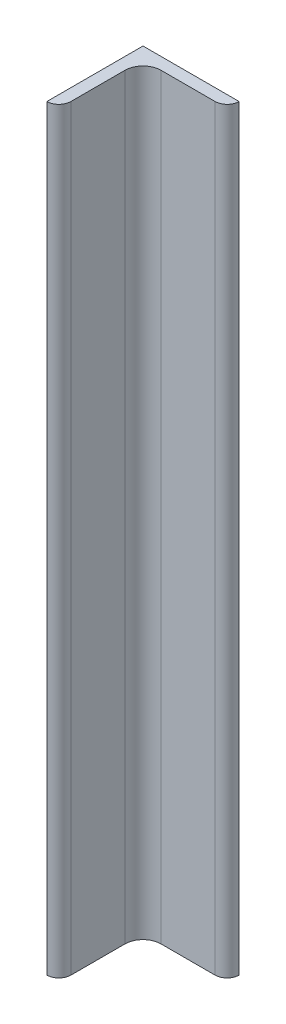
ISO-10303-21;
HEADER;
FILE_DESCRIPTION(('STEP AP214'),'2;1');
FILE_NAME('part.step','',(''),(''),'','','');
FILE_SCHEMA(('AUTOMOTIVE_DESIGN { 1 0 10303 214 1 1 1 1 }'));
ENDSEC;
DATA;
#1=APPLICATION_CONTEXT('core data for automotive mechanical design processes');
#2=APPLICATION_PROTOCOL_DEFINITION('international standard','automotive_design',2000,#1);
#3=PRODUCT_CONTEXT('',#1,'mechanical');
#4=PRODUCT('Part','Part','',(#3));
#5=PRODUCT_RELATED_PRODUCT_CATEGORY('part','',(#4));
#6=PRODUCT_DEFINITION_FORMATION('','',#4);
#7=PRODUCT_DEFINITION_CONTEXT('part definition',#1,'design');
#8=PRODUCT_DEFINITION('design','',#6,#7);
#9=PRODUCT_DEFINITION_SHAPE('','',#8);
#10=(LENGTH_UNIT() NAMED_UNIT(*) SI_UNIT(.MILLI.,.METRE.));
#11=(NAMED_UNIT(*) PLANE_ANGLE_UNIT() SI_UNIT($,.RADIAN.));
#12=(NAMED_UNIT(*) SI_UNIT($,.STERADIAN.) SOLID_ANGLE_UNIT());
#13=UNCERTAINTY_MEASURE_WITH_UNIT(LENGTH_MEASURE(1.E-05),#10,'distance_accuracy_value','');
#14=(GEOMETRIC_REPRESENTATION_CONTEXT(3) GLOBAL_UNCERTAINTY_ASSIGNED_CONTEXT((#13)) GLOBAL_UNIT_ASSIGNED_CONTEXT((#10,
#11,#12)) REPRESENTATION_CONTEXT('',''));
#15=CARTESIAN_POINT('',(0.,0.,0.));
#16=DIRECTION('',(0.,0.,1.));
#17=DIRECTION('',(1.,0.,0.));
#18=AXIS2_PLACEMENT_3D('',#15,#16,#17);
#19=CARTESIAN_POINT('',(0.,200.,25.4));
#20=DIRECTION('',(1.,0.,0.));
#21=DIRECTION('',(0.,0.,-1.));
#22=AXIS2_PLACEMENT_3D('',#19,#20,#21);
#23=PLANE('',#22);
#24=DIRECTION('',(0.,0.,1.));
#25=VECTOR('',#24,1.);
#26=CARTESIAN_POINT('',(0.,0.,25.4));
#27=LINE('',#26,#25);
#28=CARTESIAN_POINT('',(0.,0.,0.));
#29=VERTEX_POINT('',#28);
#30=CARTESIAN_POINT('',(0.,0.,25.4));
#31=VERTEX_POINT('',#30);
#32=EDGE_CURVE('E169',#29,#31,#27,.T.);
#33=ORIENTED_EDGE('',*,*,#32,.T.);
#34=DIRECTION('',(0.,-1.,0.));
#35=VECTOR('',#34,1.);
#36=CARTESIAN_POINT('',(0.,200.,25.4));
#37=LINE('',#36,#35);
#38=CARTESIAN_POINT('',(0.,200.,25.4));
#39=VERTEX_POINT('',#38);
#40=EDGE_CURVE('E13',#39,#31,#37,.T.);
#41=ORIENTED_EDGE('',*,*,#40,.F.);
#42=DIRECTION('',(0.,0.,1.));
#43=VECTOR('',#42,1.);
#44=CARTESIAN_POINT('',(0.,200.,25.4));
#45=LINE('',#44,#43);
#46=CARTESIAN_POINT('',(0.,200.,0.));
#47=VERTEX_POINT('',#46);
#48=EDGE_CURVE('E185',#47,#39,#45,.T.);
#49=ORIENTED_EDGE('',*,*,#48,.F.);
#50=DIRECTION('',(0.,-1.,0.));
#51=VECTOR('',#50,1.);
#52=CARTESIAN_POINT('',(0.,200.,0.));
#53=LINE('',#52,#51);
#54=EDGE_CURVE('E165',#47,#29,#53,.T.);
#55=ORIENTED_EDGE('',*,*,#54,.T.);
#56=EDGE_LOOP('',(#33,#41,#49,#55));
#57=FACE_BOUND('',#56,.T.);
#58=ADVANCED_FACE('F67',(#57),#23,.F.);
#59=CARTESIAN_POINT('',(0.00508,200.,25.4));
#60=DIRECTION('',(0.,0.,-1.));
#61=DIRECTION('',(-1.,0.,0.));
#62=AXIS2_PLACEMENT_3D('',#59,#60,#61);
#63=PLANE('',#62);
#64=DIRECTION('',(1.,0.,0.));
#65=VECTOR('',#64,1.);
#66=CARTESIAN_POINT('',(0.00508,0.,25.4));
#67=LINE('',#66,#65);
#68=CARTESIAN_POINT('',(0.00508,0.,25.4));
#69=VERTEX_POINT('',#68);
#70=EDGE_CURVE('E172',#31,#69,#67,.T.);
#71=ORIENTED_EDGE('',*,*,#70,.T.);
#72=DIRECTION('',(0.,-1.,0.));
#73=VECTOR('',#72,1.);
#74=CARTESIAN_POINT('',(0.00508,200.,25.4));
#75=LINE('',#74,#73);
#76=CARTESIAN_POINT('',(0.00508,200.,25.4));
#77=VERTEX_POINT('',#76);
#78=EDGE_CURVE('E75',#77,#69,#75,.T.);
#79=ORIENTED_EDGE('',*,*,#78,.F.);
#80=DIRECTION('',(1.,0.,0.));
#81=VECTOR('',#80,1.);
#82=CARTESIAN_POINT('',(0.00508,200.,25.4));
#83=LINE('',#82,#81);
#84=EDGE_CURVE('E129',#39,#77,#83,.T.);
#85=ORIENTED_EDGE('',*,*,#84,.F.);
#86=ORIENTED_EDGE('',*,*,#40,.T.);
#87=EDGE_LOOP('',(#71,#79,#85,#86));
#88=FACE_BOUND('',#87,.T.);
#89=ADVANCED_FACE('F228',(#88),#63,.F.);
#90=CARTESIAN_POINT('',(0.00507999999999961,200.,22.23008));
#91=DIRECTION('',(0.,-1.,0.));
#92=DIRECTION('',(0.,0.,-1.));
#93=AXIS2_PLACEMENT_3D('',#90,#91,#92);
#94=CYLINDRICAL_SURFACE('',#93,3.16992);
#95=CARTESIAN_POINT('',(0.00507999999999961,0.,22.23008));
#96=DIRECTION('',(0.,1.,0.));
#97=DIRECTION('',(0.,0.,1.));
#98=AXIS2_PLACEMENT_3D('',#95,#96,#97);
#99=CIRCLE('',#98,3.16992);
#100=CARTESIAN_POINT('',(3.17499999999999,0.,22.23008));
#101=VERTEX_POINT('',#100);
#102=EDGE_CURVE('E174',#69,#101,#99,.T.);
#103=ORIENTED_EDGE('',*,*,#102,.T.);
#104=DIRECTION('',(0.,-1.,0.));
#105=VECTOR('',#104,1.);
#106=CARTESIAN_POINT('',(3.17499999999999,200.,22.23008));
#107=LINE('',#106,#105);
#108=CARTESIAN_POINT('',(3.17499999999999,200.,22.23008));
#109=VERTEX_POINT('',#108);
#110=EDGE_CURVE('E195',#109,#101,#107,.T.);
#111=ORIENTED_EDGE('',*,*,#110,.F.);
#112=CARTESIAN_POINT('',(0.00507999999999961,200.,22.23008));
#113=DIRECTION('',(0.,1.,0.));
#114=DIRECTION('',(0.,0.,1.));
#115=AXIS2_PLACEMENT_3D('',#112,#113,#114);
#116=CIRCLE('',#115,3.16992);
#117=EDGE_CURVE('E203',#77,#109,#116,.T.);
#118=ORIENTED_EDGE('',*,*,#117,.F.);
#119=ORIENTED_EDGE('',*,*,#78,.T.);
#120=EDGE_LOOP('',(#103,#111,#118,#119));
#121=FACE_BOUND('',#120,.T.);
#122=ADVANCED_FACE('F201',(#121),#94,.T.);
#123=CARTESIAN_POINT('',(3.17499999999999,200.,7.93750000000001));
#124=DIRECTION('',(-1.,0.,0.));
#125=DIRECTION('',(0.,0.,1.));
#126=AXIS2_PLACEMENT_3D('',#123,#124,#125);
#127=PLANE('',#126);
#128=DIRECTION('',(0.,0.,-1.));
#129=VECTOR('',#128,1.);
#130=CARTESIAN_POINT('',(3.17499999999999,0.,7.93750000000001));
#131=LINE('',#130,#129);
#132=CARTESIAN_POINT('',(3.17499999999999,0.,7.93750000000002));
#133=VERTEX_POINT('',#132);
#134=EDGE_CURVE('E176',#101,#133,#131,.T.);
#135=ORIENTED_EDGE('',*,*,#134,.T.);
#136=DIRECTION('',(0.,-1.,0.));
#137=VECTOR('',#136,1.);
#138=CARTESIAN_POINT('',(3.17499999999999,200.,7.93750000000002));
#139=LINE('',#138,#137);
#140=CARTESIAN_POINT('',(3.17499999999999,200.,7.93750000000002));
#141=VERTEX_POINT('',#140);
#142=EDGE_CURVE('E192',#141,#133,#139,.T.);
#143=ORIENTED_EDGE('',*,*,#142,.F.);
#144=DIRECTION('',(0.,0.,-1.));
#145=VECTOR('',#144,1.);
#146=CARTESIAN_POINT('',(3.17499999999999,200.,7.93750000000001));
#147=LINE('',#146,#145);
#148=EDGE_CURVE('E219',#109,#141,#147,.T.);
#149=ORIENTED_EDGE('',*,*,#148,.F.);
#150=ORIENTED_EDGE('',*,*,#110,.T.);
#151=EDGE_LOOP('',(#135,#143,#149,#150));
#152=FACE_BOUND('',#151,.T.);
#153=ADVANCED_FACE('F212',(#152),#127,.F.);
#154=CARTESIAN_POINT('',(7.93749999999999,200.,7.93750000000001));
#155=DIRECTION('',(0.,-1.,0.));
#156=DIRECTION('',(0.,0.,-1.));
#157=AXIS2_PLACEMENT_3D('',#154,#155,#156);
#158=CYLINDRICAL_SURFACE('',#157,4.7625);
#159=CARTESIAN_POINT('',(7.93749999999999,0.,7.93750000000001));
#160=DIRECTION('',(0.,-1.,0.));
#161=DIRECTION('',(0.,0.,-1.));
#162=AXIS2_PLACEMENT_3D('',#159,#160,#161);
#163=CIRCLE('',#162,4.7625);
#164=CARTESIAN_POINT('',(7.93749999999999,0.,3.17500000000001));
#165=VERTEX_POINT('',#164);
#166=EDGE_CURVE('E178',#133,#165,#163,.T.);
#167=ORIENTED_EDGE('',*,*,#166,.T.);
#168=DIRECTION('',(0.,-1.,0.));
#169=VECTOR('',#168,1.);
#170=CARTESIAN_POINT('',(7.93749999999999,200.,3.17500000000001));
#171=LINE('',#170,#169);
#172=CARTESIAN_POINT('',(7.93749999999999,200.,3.17500000000001));
#173=VERTEX_POINT('',#172);
#174=EDGE_CURVE('E189',#173,#165,#171,.T.);
#175=ORIENTED_EDGE('',*,*,#174,.F.);
#176=CARTESIAN_POINT('',(7.93749999999999,200.,7.93750000000001));
#177=DIRECTION('',(0.,-1.,0.));
#178=DIRECTION('',(0.,0.,-1.));
#179=AXIS2_PLACEMENT_3D('',#176,#177,#178);
#180=CIRCLE('',#179,4.7625);
#181=EDGE_CURVE('E218',#141,#173,#180,.T.);
#182=ORIENTED_EDGE('',*,*,#181,.F.);
#183=ORIENTED_EDGE('',*,*,#142,.T.);
#184=EDGE_LOOP('',(#167,#175,#182,#183));
#185=FACE_BOUND('',#184,.T.);
#186=ADVANCED_FACE('F216',(#185),#158,.F.);
#187=CARTESIAN_POINT('',(22.23008,200.,3.17499999999999));
#188=DIRECTION('',(0.,0.,-1.));
#189=DIRECTION('',(-1.,0.,0.));
#190=AXIS2_PLACEMENT_3D('',#187,#188,#189);
#191=PLANE('',#190);
#192=DIRECTION('',(1.,0.,0.));
#193=VECTOR('',#192,1.);
#194=CARTESIAN_POINT('',(22.23008,0.,3.17499999999999));
#195=LINE('',#194,#193);
#196=CARTESIAN_POINT('',(22.23008,0.,3.17499999999999));
#197=VERTEX_POINT('',#196);
#198=EDGE_CURVE('E180',#165,#197,#195,.T.);
#199=ORIENTED_EDGE('',*,*,#198,.T.);
#200=DIRECTION('',(0.,-1.,0.));
#201=VECTOR('',#200,1.);
#202=CARTESIAN_POINT('',(22.23008,200.,3.17499999999999));
#203=LINE('',#202,#201);
#204=CARTESIAN_POINT('',(22.23008,200.,3.17499999999999));
#205=VERTEX_POINT('',#204);
#206=EDGE_CURVE('E160',#205,#197,#203,.T.);
#207=ORIENTED_EDGE('',*,*,#206,.F.);
#208=DIRECTION('',(1.,0.,0.));
#209=VECTOR('',#208,1.);
#210=CARTESIAN_POINT('',(22.23008,200.,3.17499999999999));
#211=LINE('',#210,#209);
#212=EDGE_CURVE('E151',#173,#205,#211,.T.);
#213=ORIENTED_EDGE('',*,*,#212,.F.);
#214=ORIENTED_EDGE('',*,*,#174,.T.);
#215=EDGE_LOOP('',(#199,#207,#213,#214));
#216=FACE_BOUND('',#215,.T.);
#217=ADVANCED_FACE('F240',(#216),#191,.F.);
#218=CARTESIAN_POINT('',(22.23008,200.,0.00508000000000019));
#219=DIRECTION('',(0.,-1.,0.));
#220=DIRECTION('',(0.,0.,-1.));
#221=AXIS2_PLACEMENT_3D('',#218,#219,#220);
#222=CYLINDRICAL_SURFACE('',#221,3.16991999999999);
#223=CARTESIAN_POINT('',(22.23008,0.,0.00508000000000019));
#224=DIRECTION('',(0.,1.,0.));
#225=DIRECTION('',(0.,0.,-1.));
#226=AXIS2_PLACEMENT_3D('',#223,#224,#225);
#227=CIRCLE('',#226,3.16991999999999);
#228=CARTESIAN_POINT('',(25.4,0.,0.00508));
#229=VERTEX_POINT('',#228);
#230=EDGE_CURVE('E159',#197,#229,#227,.T.);
#231=ORIENTED_EDGE('',*,*,#230,.T.);
#232=DIRECTION('',(0.,-1.,0.));
#233=VECTOR('',#232,1.);
#234=CARTESIAN_POINT('',(25.4,200.,0.00508));
#235=LINE('',#234,#233);
#236=CARTESIAN_POINT('',(25.4,200.,0.00508));
#237=VERTEX_POINT('',#236);
#238=EDGE_CURVE('E156',#237,#229,#235,.T.);
#239=ORIENTED_EDGE('',*,*,#238,.F.);
#240=CARTESIAN_POINT('',(22.23008,200.,0.00508000000000019));
#241=DIRECTION('',(0.,1.,0.));
#242=DIRECTION('',(0.,0.,-1.));
#243=AXIS2_PLACEMENT_3D('',#240,#241,#242);
#244=CIRCLE('',#243,3.16991999999999);
#245=EDGE_CURVE('E145',#205,#237,#244,.T.);
#246=ORIENTED_EDGE('',*,*,#245,.F.);
#247=ORIENTED_EDGE('',*,*,#206,.T.);
#248=EDGE_LOOP('',(#231,#239,#246,#247));
#249=FACE_BOUND('',#248,.T.);
#250=ADVANCED_FACE('F157',(#249),#222,.T.);
#251=CARTESIAN_POINT('',(25.4,200.,0.));
#252=DIRECTION('',(-1.,0.,0.));
#253=DIRECTION('',(0.,0.,1.));
#254=AXIS2_PLACEMENT_3D('',#251,#252,#253);
#255=PLANE('',#254);
#256=DIRECTION('',(0.,0.,-1.));
#257=VECTOR('',#256,1.);
#258=CARTESIAN_POINT('',(25.4,0.,0.));
#259=LINE('',#258,#257);
#260=CARTESIAN_POINT('',(25.4,0.,0.));
#261=VERTEX_POINT('',#260);
#262=EDGE_CURVE('E115',#229,#261,#259,.T.);
#263=ORIENTED_EDGE('',*,*,#262,.T.);
#264=DIRECTION('',(0.,-1.,0.));
#265=VECTOR('',#264,1.);
#266=CARTESIAN_POINT('',(25.4,200.,0.));
#267=LINE('',#266,#265);
#268=CARTESIAN_POINT('',(25.4,200.,0.));
#269=VERTEX_POINT('',#268);
#270=EDGE_CURVE('E161',#269,#261,#267,.T.);
#271=ORIENTED_EDGE('',*,*,#270,.F.);
#272=DIRECTION('',(0.,0.,-1.));
#273=VECTOR('',#272,1.);
#274=CARTESIAN_POINT('',(25.4,200.,0.));
#275=LINE('',#274,#273);
#276=EDGE_CURVE('E149',#237,#269,#275,.T.);
#277=ORIENTED_EDGE('',*,*,#276,.F.);
#278=ORIENTED_EDGE('',*,*,#238,.T.);
#279=EDGE_LOOP('',(#263,#271,#277,#278));
#280=FACE_BOUND('',#279,.T.);
#281=ADVANCED_FACE('F163',(#280),#255,.F.);
#282=CARTESIAN_POINT('',(0.,200.,0.));
#283=DIRECTION('',(0.,0.,1.));
#284=DIRECTION('',(1.,0.,0.));
#285=AXIS2_PLACEMENT_3D('',#282,#283,#284);
#286=PLANE('',#285);
#287=DIRECTION('',(-1.,0.,0.));
#288=VECTOR('',#287,1.);
#289=CARTESIAN_POINT('',(0.,0.,0.));
#290=LINE('',#289,#288);
#291=EDGE_CURVE('E121',#261,#29,#290,.T.);
#292=ORIENTED_EDGE('',*,*,#291,.T.);
#293=ORIENTED_EDGE('',*,*,#54,.F.);
#294=DIRECTION('',(-1.,0.,0.));
#295=VECTOR('',#294,1.);
#296=CARTESIAN_POINT('',(0.,200.,0.));
#297=LINE('',#296,#295);
#298=EDGE_CURVE('E83',#269,#47,#297,.T.);
#299=ORIENTED_EDGE('',*,*,#298,.F.);
#300=ORIENTED_EDGE('',*,*,#270,.T.);
#301=EDGE_LOOP('',(#292,#293,#299,#300));
#302=FACE_BOUND('',#301,.T.);
#303=ADVANCED_FACE('F248',(#302),#286,.F.);
#304=CARTESIAN_POINT('',(22.23008,200.,0.00508000000000019));
#305=DIRECTION('',(0.,-1.,0.));
#306=DIRECTION('',(0.,0.,-1.));
#307=AXIS2_PLACEMENT_3D('',#304,#305,#306);
#308=PLANE('',#307);
#309=ORIENTED_EDGE('',*,*,#48,.T.);
#310=ORIENTED_EDGE('',*,*,#84,.T.);
#311=ORIENTED_EDGE('',*,*,#117,.T.);
#312=ORIENTED_EDGE('',*,*,#148,.T.);
#313=ORIENTED_EDGE('',*,*,#181,.T.);
#314=ORIENTED_EDGE('',*,*,#212,.T.);
#315=ORIENTED_EDGE('',*,*,#245,.T.);
#316=ORIENTED_EDGE('',*,*,#276,.T.);
#317=ORIENTED_EDGE('',*,*,#298,.T.);
#318=EDGE_LOOP('',(#309,#310,#311,#312,#313,#314,#315,#316,#317));
#319=FACE_BOUND('',#318,.T.);
#320=ADVANCED_FACE('F147',(#319),#308,.F.);
#321=CARTESIAN_POINT('',(22.23008,0.,0.00508000000000019));
#322=DIRECTION('',(0.,-1.,0.));
#323=DIRECTION('',(0.,0.,-1.));
#324=AXIS2_PLACEMENT_3D('',#321,#322,#323);
#325=PLANE('',#324);
#326=ORIENTED_EDGE('',*,*,#32,.F.);
#327=ORIENTED_EDGE('',*,*,#291,.F.);
#328=ORIENTED_EDGE('',*,*,#262,.F.);
#329=ORIENTED_EDGE('',*,*,#230,.F.);
#330=ORIENTED_EDGE('',*,*,#198,.F.);
#331=ORIENTED_EDGE('',*,*,#166,.F.);
#332=ORIENTED_EDGE('',*,*,#134,.F.);
#333=ORIENTED_EDGE('',*,*,#102,.F.);
#334=ORIENTED_EDGE('',*,*,#70,.F.);
#335=EDGE_LOOP('',(#326,#327,#328,#329,#330,#331,#332,#333,#334));
#336=FACE_BOUND('',#335,.T.);
#337=ADVANCED_FACE('F207',(#336),#325,.T.);
#338=CLOSED_SHELL('',(#58,#89,#122,#153,#186,#217,#250,#281,#303,#320,#337));
#339=MANIFOLD_SOLID_BREP('B2',#338);
#340=ADVANCED_BREP_SHAPE_REPRESENTATION('',(#18,#339),#14);
#341=SHAPE_DEFINITION_REPRESENTATION(#9,#340);
ENDSEC;
END-ISO-10303-21;
